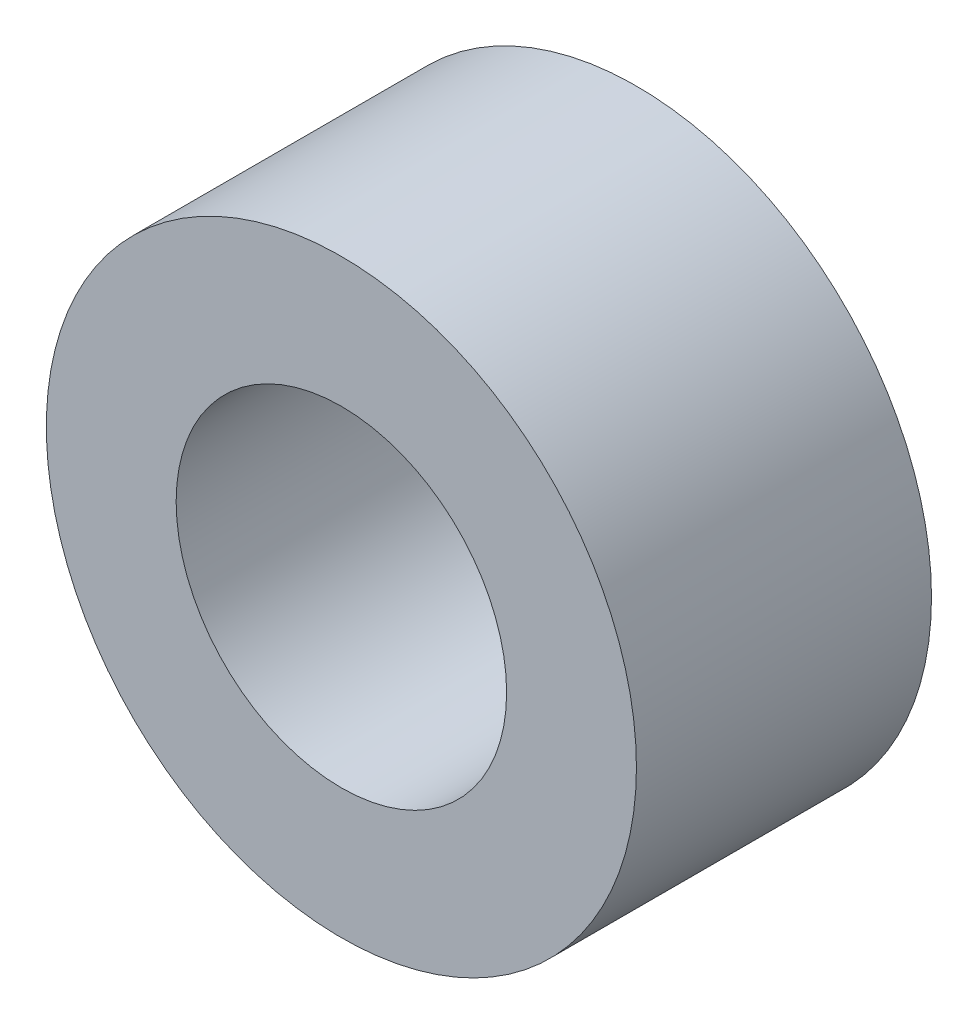
ISO-10303-21;
HEADER;
FILE_DESCRIPTION(('STEP AP214'),'2;1');
FILE_NAME('part.step','',(''),(''),'','','');
FILE_SCHEMA(('AUTOMOTIVE_DESIGN { 1 0 10303 214 1 1 1 1 }'));
ENDSEC;
DATA;
#1=APPLICATION_CONTEXT('core data for automotive mechanical design processes');
#2=APPLICATION_PROTOCOL_DEFINITION('international standard','automotive_design',2000,#1);
#3=PRODUCT_CONTEXT('',#1,'mechanical');
#4=PRODUCT('Part','Part','',(#3));
#5=PRODUCT_RELATED_PRODUCT_CATEGORY('part','',(#4));
#6=PRODUCT_DEFINITION_FORMATION('','',#4);
#7=PRODUCT_DEFINITION_CONTEXT('part definition',#1,'design');
#8=PRODUCT_DEFINITION('design','',#6,#7);
#9=PRODUCT_DEFINITION_SHAPE('','',#8);
#10=(LENGTH_UNIT() NAMED_UNIT(*) SI_UNIT(.MILLI.,.METRE.));
#11=(NAMED_UNIT(*) PLANE_ANGLE_UNIT() SI_UNIT($,.RADIAN.));
#12=(NAMED_UNIT(*) SI_UNIT($,.STERADIAN.) SOLID_ANGLE_UNIT());
#13=UNCERTAINTY_MEASURE_WITH_UNIT(LENGTH_MEASURE(1.E-05),#10,'distance_accuracy_value','');
#14=(GEOMETRIC_REPRESENTATION_CONTEXT(3) GLOBAL_UNCERTAINTY_ASSIGNED_CONTEXT((#13)) GLOBAL_UNIT_ASSIGNED_CONTEXT((#10,
#11,#12)) REPRESENTATION_CONTEXT('',''));
#15=CARTESIAN_POINT('',(0.,0.,0.));
#16=DIRECTION('',(0.,0.,1.));
#17=DIRECTION('',(1.,0.,0.));
#18=AXIS2_PLACEMENT_3D('',#15,#16,#17);
#19=CARTESIAN_POINT('',(0.,0.,1.5875));
#20=DIRECTION('',(0.,0.,1.));
#21=DIRECTION('',(1.,0.,0.));
#22=AXIS2_PLACEMENT_3D('',#19,#20,#21);
#23=PLANE('',#22);
#24=CARTESIAN_POINT('',(0.,0.,1.5875));
#25=DIRECTION('',(0.,0.,1.));
#26=DIRECTION('',(1.,0.,0.));
#27=AXIS2_PLACEMENT_3D('',#24,#25,#26);
#28=CIRCLE('',#27,3.175);
#29=CARTESIAN_POINT('',(3.175,0.,1.5875));
#30=VERTEX_POINT('',#29);
#31=EDGE_CURVE('E10',#30,#30,#28,.T.);
#32=ORIENTED_EDGE('',*,*,#31,.T.);
#33=EDGE_LOOP('',(#32));
#34=FACE_BOUND('',#33,.T.);
#35=CARTESIAN_POINT('',(0.,0.,1.5875));
#36=DIRECTION('',(0.,0.,1.));
#37=DIRECTION('',(1.,0.,0.));
#38=AXIS2_PLACEMENT_3D('',#35,#36,#37);
#39=CIRCLE('',#38,1.778);
#40=CARTESIAN_POINT('',(1.778,0.,1.5875));
#41=VERTEX_POINT('',#40);
#42=EDGE_CURVE('E49',#41,#41,#39,.T.);
#43=ORIENTED_EDGE('',*,*,#42,.F.);
#44=EDGE_LOOP('',(#43));
#45=FACE_BOUND('',#44,.T.);
#46=ADVANCED_FACE('F34',(#34,#45),#23,.T.);
#47=CARTESIAN_POINT('',(0.,0.,-1.5875));
#48=DIRECTION('',(0.,0.,1.));
#49=DIRECTION('',(1.,0.,0.));
#50=AXIS2_PLACEMENT_3D('',#47,#48,#49);
#51=PLANE('',#50);
#52=CARTESIAN_POINT('',(0.,0.,-1.5875));
#53=DIRECTION('',(0.,0.,1.));
#54=DIRECTION('',(1.,0.,0.));
#55=AXIS2_PLACEMENT_3D('',#52,#53,#54);
#56=CIRCLE('',#55,3.175);
#57=CARTESIAN_POINT('',(3.175,0.,-1.5875));
#58=VERTEX_POINT('',#57);
#59=EDGE_CURVE('E38',#58,#58,#56,.T.);
#60=ORIENTED_EDGE('',*,*,#59,.F.);
#61=EDGE_LOOP('',(#60));
#62=FACE_BOUND('',#61,.T.);
#63=CARTESIAN_POINT('',(0.,0.,-1.5875));
#64=DIRECTION('',(0.,0.,1.));
#65=DIRECTION('',(1.,0.,0.));
#66=AXIS2_PLACEMENT_3D('',#63,#64,#65);
#67=CIRCLE('',#66,1.778);
#68=CARTESIAN_POINT('',(1.778,0.,-1.5875));
#69=VERTEX_POINT('',#68);
#70=EDGE_CURVE('E51',#69,#69,#67,.T.);
#71=ORIENTED_EDGE('',*,*,#70,.T.);
#72=EDGE_LOOP('',(#71));
#73=FACE_BOUND('',#72,.T.);
#74=ADVANCED_FACE('F61',(#62,#73),#51,.F.);
#75=CARTESIAN_POINT('',(0.,0.,1.5875));
#76=DIRECTION('',(0.,0.,-1.));
#77=DIRECTION('',(-1.,0.,0.));
#78=AXIS2_PLACEMENT_3D('',#75,#76,#77);
#79=CYLINDRICAL_SURFACE('',#78,3.175);
#80=ORIENTED_EDGE('',*,*,#31,.F.);
#81=EDGE_LOOP('',(#80));
#82=FACE_BOUND('',#81,.T.);
#83=ORIENTED_EDGE('',*,*,#59,.T.);
#84=EDGE_LOOP('',(#83));
#85=FACE_BOUND('',#84,.T.);
#86=ADVANCED_FACE('F36',(#82,#85),#79,.T.);
#87=CARTESIAN_POINT('',(0.,0.,1.5875));
#88=DIRECTION('',(0.,0.,-1.));
#89=DIRECTION('',(-1.,0.,0.));
#90=AXIS2_PLACEMENT_3D('',#87,#88,#89);
#91=CYLINDRICAL_SURFACE('',#90,1.778);
#92=ORIENTED_EDGE('',*,*,#42,.T.);
#93=EDGE_LOOP('',(#92));
#94=FACE_BOUND('',#93,.T.);
#95=ORIENTED_EDGE('',*,*,#70,.F.);
#96=EDGE_LOOP('',(#95));
#97=FACE_BOUND('',#96,.T.);
#98=ADVANCED_FACE('F57',(#94,#97),#91,.F.);
#99=CLOSED_SHELL('',(#46,#74,#86,#98));
#100=MANIFOLD_SOLID_BREP('B2',#99);
#101=ADVANCED_BREP_SHAPE_REPRESENTATION('',(#18,#100),#14);
#102=SHAPE_DEFINITION_REPRESENTATION(#9,#101);
ENDSEC;
END-ISO-10303-21;
